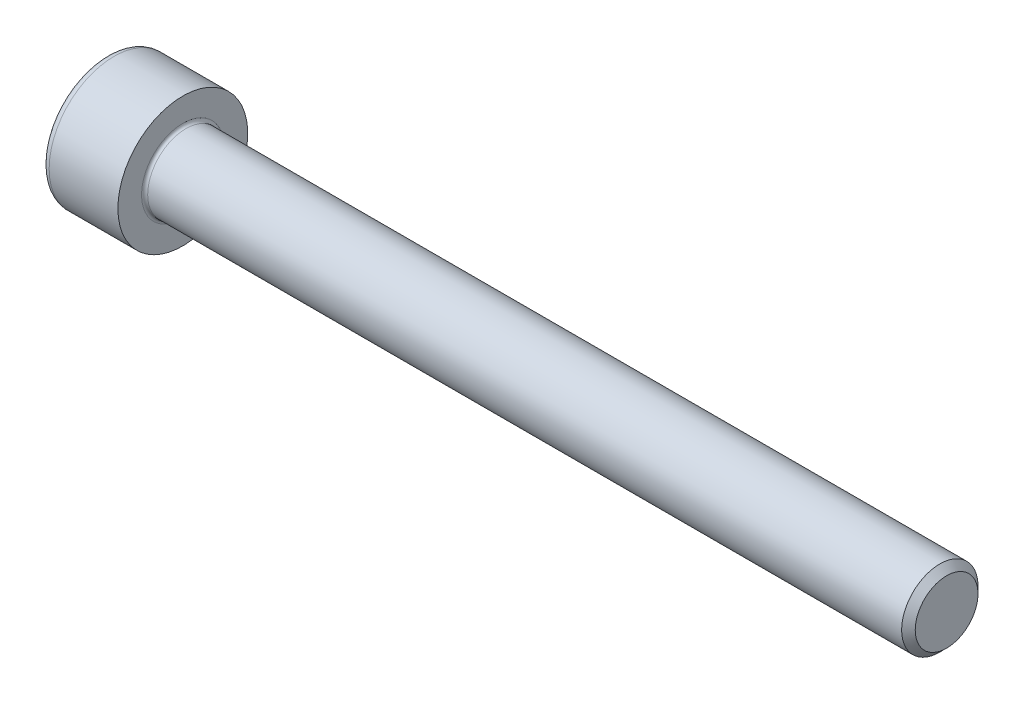
ISO-10303-21;
HEADER;
FILE_DESCRIPTION(('STEP AP214'),'2;1');
FILE_NAME('part.step','',(''),(''),'','','');
FILE_SCHEMA(('AUTOMOTIVE_DESIGN { 1 0 10303 214 1 1 1 1 }'));
ENDSEC;
DATA;
#1=APPLICATION_CONTEXT('core data for automotive mechanical design processes');
#2=APPLICATION_PROTOCOL_DEFINITION('international standard','automotive_design',2000,#1);
#3=PRODUCT_CONTEXT('',#1,'mechanical');
#4=PRODUCT('Part','Part','',(#3));
#5=PRODUCT_RELATED_PRODUCT_CATEGORY('part','',(#4));
#6=PRODUCT_DEFINITION_FORMATION('','',#4);
#7=PRODUCT_DEFINITION_CONTEXT('part definition',#1,'design');
#8=PRODUCT_DEFINITION('design','',#6,#7);
#9=PRODUCT_DEFINITION_SHAPE('','',#8);
#10=(LENGTH_UNIT() NAMED_UNIT(*) SI_UNIT(.MILLI.,.METRE.));
#11=(NAMED_UNIT(*) PLANE_ANGLE_UNIT() SI_UNIT($,.RADIAN.));
#12=(NAMED_UNIT(*) SI_UNIT($,.STERADIAN.) SOLID_ANGLE_UNIT());
#13=UNCERTAINTY_MEASURE_WITH_UNIT(LENGTH_MEASURE(1.E-05),#10,'distance_accuracy_value','');
#14=(GEOMETRIC_REPRESENTATION_CONTEXT(3) GLOBAL_UNCERTAINTY_ASSIGNED_CONTEXT((#13)) GLOBAL_UNIT_ASSIGNED_CONTEXT((#10,
#11,#12)) REPRESENTATION_CONTEXT('',''));
#15=CARTESIAN_POINT('',(0.,0.,0.));
#16=DIRECTION('',(0.,0.,1.));
#17=DIRECTION('',(1.,0.,0.));
#18=AXIS2_PLACEMENT_3D('',#15,#16,#17);
#19=CARTESIAN_POINT('',(0.,0.,0.));
#20=DIRECTION('',(-1.,0.,0.));
#21=DIRECTION('',(0.,0.,1.));
#22=AXIS2_PLACEMENT_3D('',#19,#20,#21);
#23=PLANE('',#22);
#24=DIRECTION('',(0.,-0.499999999999999,0.866025403784439));
#25=VECTOR('',#24,1.);
#26=CARTESIAN_POINT('',(0.,2.32094808214229,0.));
#27=LINE('',#26,#25);
#28=CARTESIAN_POINT('',(0.,2.32094808214229,0.));
#29=VERTEX_POINT('',#28);
#30=CARTESIAN_POINT('',(0.,1.16047404107115,2.01));
#31=VERTEX_POINT('',#30);
#32=EDGE_CURVE('E373',#29,#31,#27,.T.);
#33=ORIENTED_EDGE('',*,*,#32,.T.);
#34=DIRECTION('',(0.,1.,0.));
#35=VECTOR('',#34,1.);
#36=CARTESIAN_POINT('',(0.,-1.16047404107115,2.01));
#37=LINE('',#36,#35);
#38=CARTESIAN_POINT('',(0.,-1.16047404107115,2.01));
#39=VERTEX_POINT('',#38);
#40=EDGE_CURVE('E130',#39,#31,#37,.T.);
#41=ORIENTED_EDGE('',*,*,#40,.F.);
#42=DIRECTION('',(0.,-0.500000000000001,-0.866025403784438));
#43=VECTOR('',#42,1.);
#44=CARTESIAN_POINT('',(0.,-1.16047404107115,2.01));
#45=LINE('',#44,#43);
#46=CARTESIAN_POINT('',(0.,-2.3209480821423,0.));
#47=VERTEX_POINT('',#46);
#48=EDGE_CURVE('E376',#39,#47,#45,.T.);
#49=ORIENTED_EDGE('',*,*,#48,.T.);
#50=DIRECTION('',(0.,0.499999999999999,-0.866025403784439));
#51=VECTOR('',#50,1.);
#52=CARTESIAN_POINT('',(0.,-2.3209480821423,0.));
#53=LINE('',#52,#51);
#54=CARTESIAN_POINT('',(0.,-1.16047404107116,-2.01));
#55=VERTEX_POINT('',#54);
#56=EDGE_CURVE('E379',#47,#55,#53,.T.);
#57=ORIENTED_EDGE('',*,*,#56,.T.);
#58=DIRECTION('',(0.,-1.,0.));
#59=VECTOR('',#58,1.);
#60=CARTESIAN_POINT('',(0.,1.16047404107114,-2.01));
#61=LINE('',#60,#59);
#62=CARTESIAN_POINT('',(0.,1.16047404107114,-2.01));
#63=VERTEX_POINT('',#62);
#64=EDGE_CURVE('E382',#63,#55,#61,.T.);
#65=ORIENTED_EDGE('',*,*,#64,.F.);
#66=DIRECTION('',(0.,-0.500000000000001,-0.866025403784438));
#67=VECTOR('',#66,1.);
#68=CARTESIAN_POINT('',(0.,2.32094808214229,0.));
#69=LINE('',#68,#67);
#70=EDGE_CURVE('E125',#29,#63,#69,.T.);
#71=ORIENTED_EDGE('',*,*,#70,.F.);
#72=EDGE_LOOP('',(#33,#41,#49,#57,#65,#71));
#73=FACE_BOUND('',#72,.T.);
#74=CARTESIAN_POINT('',(0.,0.,0.));
#75=DIRECTION('',(-1.,0.,0.));
#76=DIRECTION('',(0.,0.,1.));
#77=AXIS2_PLACEMENT_3D('',#74,#75,#76);
#78=CIRCLE('',#77,3.75);
#79=CARTESIAN_POINT('',(0.,0.,3.75));
#80=VERTEX_POINT('',#79);
#81=EDGE_CURVE('E42',#80,#80,#78,.T.);
#82=ORIENTED_EDGE('',*,*,#81,.T.);
#83=EDGE_LOOP('',(#82));
#84=FACE_BOUND('',#83,.T.);
#85=ADVANCED_FACE('F34',(#73,#84),#23,.T.);
#86=CARTESIAN_POINT('',(55.,2.055,0.));
#87=DIRECTION('',(1.,0.,0.));
#88=DIRECTION('',(0.,0.,-1.));
#89=AXIS2_PLACEMENT_3D('',#86,#87,#88);
#90=PLANE('',#89);
#91=CARTESIAN_POINT('',(55.,0.,0.));
#92=DIRECTION('',(-1.,0.,0.));
#93=DIRECTION('',(0.,0.,1.));
#94=AXIS2_PLACEMENT_3D('',#91,#92,#93);
#95=CIRCLE('',#94,2.055);
#96=CARTESIAN_POINT('',(55.,0.,2.055));
#97=VERTEX_POINT('',#96);
#98=EDGE_CURVE('E148',#97,#97,#95,.T.);
#99=ORIENTED_EDGE('',*,*,#98,.F.);
#100=EDGE_LOOP('',(#99));
#101=FACE_BOUND('',#100,.T.);
#102=ADVANCED_FACE('F172',(#101),#90,.T.);
#103=CARTESIAN_POINT('',(55.,0.,0.));
#104=DIRECTION('',(-1.,0.,0.));
#105=DIRECTION('',(0.,0.,1.));
#106=AXIS2_PLACEMENT_3D('',#103,#104,#105);
#107=CONICAL_SURFACE('',#106,2.055,0.785398163397421);
#108=CARTESIAN_POINT('',(54.555,0.,0.));
#109=DIRECTION('',(-1.,0.,0.));
#110=DIRECTION('',(0.,0.,1.));
#111=AXIS2_PLACEMENT_3D('',#108,#109,#110);
#112=CIRCLE('',#111,2.49999999999999);
#113=CARTESIAN_POINT('',(54.555,0.,2.49999999999999));
#114=VERTEX_POINT('',#113);
#115=EDGE_CURVE('E145',#114,#114,#112,.T.);
#116=ORIENTED_EDGE('',*,*,#115,.F.);
#117=EDGE_LOOP('',(#116));
#118=FACE_BOUND('',#117,.T.);
#119=ORIENTED_EDGE('',*,*,#98,.T.);
#120=EDGE_LOOP('',(#119));
#121=FACE_BOUND('',#120,.T.);
#122=ADVANCED_FACE('F178',(#118,#121),#107,.T.);
#123=CARTESIAN_POINT('',(-31.75,0.,0.));
#124=DIRECTION('',(-1.,0.,0.));
#125=DIRECTION('',(0.,0.,1.));
#126=AXIS2_PLACEMENT_3D('',#123,#124,#125);
#127=CYLINDRICAL_SURFACE('',#126,2.49999999999999);
#128=CARTESIAN_POINT('',(5.2,0.,0.));
#129=DIRECTION('',(1.,0.,0.));
#130=DIRECTION('',(0.,0.,-1.));
#131=AXIS2_PLACEMENT_3D('',#128,#129,#130);
#132=CIRCLE('',#131,2.49999999999999);
#133=CARTESIAN_POINT('',(5.2,0.,-2.49999999999999));
#134=VERTEX_POINT('',#133);
#135=EDGE_CURVE('E154',#134,#134,#132,.T.);
#136=ORIENTED_EDGE('',*,*,#135,.T.);
#137=EDGE_LOOP('',(#136));
#138=FACE_BOUND('',#137,.T.);
#139=ORIENTED_EDGE('',*,*,#115,.T.);
#140=EDGE_LOOP('',(#139));
#141=FACE_BOUND('',#140,.T.);
#142=ADVANCED_FACE('F190',(#138,#141),#127,.T.);
#143=CARTESIAN_POINT('',(5.,4.25,0.));
#144=DIRECTION('',(1.,0.,0.));
#145=DIRECTION('',(0.,0.,-1.));
#146=AXIS2_PLACEMENT_3D('',#143,#144,#145);
#147=PLANE('',#146);
#148=CARTESIAN_POINT('',(5.,0.,0.));
#149=DIRECTION('',(1.,0.,0.));
#150=DIRECTION('',(0.,0.,-1.));
#151=AXIS2_PLACEMENT_3D('',#148,#149,#150);
#152=CIRCLE('',#151,2.69999999999999);
#153=CARTESIAN_POINT('',(5.,0.,-2.69999999999999));
#154=VERTEX_POINT('',#153);
#155=EDGE_CURVE('E151',#154,#154,#152,.F.);
#156=ORIENTED_EDGE('',*,*,#155,.T.);
#157=EDGE_LOOP('',(#156));
#158=FACE_BOUND('',#157,.T.);
#159=CARTESIAN_POINT('',(5.,0.,0.));
#160=DIRECTION('',(-1.,0.,0.));
#161=DIRECTION('',(0.,0.,1.));
#162=AXIS2_PLACEMENT_3D('',#159,#160,#161);
#163=CIRCLE('',#162,4.25);
#164=CARTESIAN_POINT('',(5.,0.,4.25));
#165=VERTEX_POINT('',#164);
#166=EDGE_CURVE('E141',#165,#165,#163,.T.);
#167=ORIENTED_EDGE('',*,*,#166,.F.);
#168=EDGE_LOOP('',(#167));
#169=FACE_BOUND('',#168,.T.);
#170=ADVANCED_FACE('F186',(#158,#169),#147,.T.);
#171=CARTESIAN_POINT('',(-31.75,0.,0.));
#172=DIRECTION('',(-1.,0.,0.));
#173=DIRECTION('',(0.,0.,1.));
#174=AXIS2_PLACEMENT_3D('',#171,#172,#173);
#175=CYLINDRICAL_SURFACE('',#174,4.25);
#176=CARTESIAN_POINT('',(0.5,0.,0.));
#177=DIRECTION('',(-1.,0.,0.));
#178=DIRECTION('',(0.,0.,1.));
#179=AXIS2_PLACEMENT_3D('',#176,#177,#178);
#180=CIRCLE('',#179,4.25);
#181=CARTESIAN_POINT('',(0.5,0.,4.25));
#182=VERTEX_POINT('',#181);
#183=EDGE_CURVE('E11',#182,#182,#180,.F.);
#184=ORIENTED_EDGE('',*,*,#183,.T.);
#185=EDGE_LOOP('',(#184));
#186=FACE_BOUND('',#185,.T.);
#187=ORIENTED_EDGE('',*,*,#166,.T.);
#188=EDGE_LOOP('',(#187));
#189=FACE_BOUND('',#188,.T.);
#190=ADVANCED_FACE('F168',(#186,#189),#175,.T.);
#191=CARTESIAN_POINT('',(5.2,0.,0.));
#192=DIRECTION('',(1.,0.,0.));
#193=DIRECTION('',(0.,0.,-1.));
#194=AXIS2_PLACEMENT_3D('',#191,#192,#193);
#195=TOROIDAL_SURFACE('',#194,2.69999999999999,0.2);
#196=ORIENTED_EDGE('',*,*,#135,.F.);
#197=EDGE_LOOP('',(#196));
#198=FACE_BOUND('',#197,.T.);
#199=ORIENTED_EDGE('',*,*,#155,.F.);
#200=EDGE_LOOP('',(#199));
#201=FACE_BOUND('',#200,.T.);
#202=ADVANCED_FACE('F161',(#198,#201),#195,.F.);
#203=CARTESIAN_POINT('',(0.5,0.,0.));
#204=DIRECTION('',(-1.,0.,0.));
#205=DIRECTION('',(0.,0.,1.));
#206=AXIS2_PLACEMENT_3D('',#203,#204,#205);
#207=TOROIDAL_SURFACE('',#206,3.75,0.5);
#208=ORIENTED_EDGE('',*,*,#183,.F.);
#209=EDGE_LOOP('',(#208));
#210=FACE_BOUND('',#209,.T.);
#211=ORIENTED_EDGE('',*,*,#81,.F.);
#212=EDGE_LOOP('',(#211));
#213=FACE_BOUND('',#212,.T.);
#214=ADVANCED_FACE('F36',(#210,#213),#207,.T.);
#215=CARTESIAN_POINT('',(2.5,2.32094808214229,0.));
#216=DIRECTION('',(0.,-0.866025403784439,-0.499999999999999));
#217=DIRECTION('',(0.,0.499999999999999,-0.866025403784439));
#218=AXIS2_PLACEMENT_3D('',#215,#216,#217);
#219=PLANE('',#218);
#220=ORIENTED_EDGE('',*,*,#32,.F.);
#221=DIRECTION('',(-1.,0.,0.));
#222=VECTOR('',#221,1.);
#223=CARTESIAN_POINT('',(2.5,2.32094808214229,0.));
#224=LINE('',#223,#222);
#225=CARTESIAN_POINT('',(2.5,2.32094808214229,0.));
#226=VERTEX_POINT('',#225);
#227=EDGE_CURVE('E363',#226,#29,#224,.T.);
#228=ORIENTED_EDGE('',*,*,#227,.F.);
#229=DIRECTION('',(0.,-0.499999999999999,0.866025403784439));
#230=VECTOR('',#229,1.);
#231=CARTESIAN_POINT('',(2.5,2.32094808214229,0.));
#232=LINE('',#231,#230);
#233=CARTESIAN_POINT('',(2.5,1.74071106160672,1.00499999999999));
#234=VERTEX_POINT('',#233);
#235=EDGE_CURVE('E117',#226,#234,#232,.T.);
#236=ORIENTED_EDGE('',*,*,#235,.T.);
#237=CARTESIAN_POINT('',(2.5,1.16047404107115,2.01));
#238=VERTEX_POINT('',#237);
#239=EDGE_CURVE('E108',#234,#238,#232,.T.);
#240=ORIENTED_EDGE('',*,*,#239,.T.);
#241=DIRECTION('',(-1.,0.,0.));
#242=VECTOR('',#241,1.);
#243=CARTESIAN_POINT('',(2.5,1.16047404107115,2.01));
#244=LINE('',#243,#242);
#245=EDGE_CURVE('E122',#238,#31,#244,.T.);
#246=ORIENTED_EDGE('',*,*,#245,.T.);
#247=EDGE_LOOP('',(#220,#228,#236,#240,#246));
#248=FACE_BOUND('',#247,.T.);
#249=ADVANCED_FACE('F121',(#248),#219,.T.);
#250=CARTESIAN_POINT('',(2.5,-1.16047404107115,2.01));
#251=DIRECTION('',(0.,0.,1.));
#252=DIRECTION('',(0.,-1.,0.));
#253=AXIS2_PLACEMENT_3D('',#250,#251,#252);
#254=PLANE('',#253);
#255=ORIENTED_EDGE('',*,*,#40,.T.);
#256=ORIENTED_EDGE('',*,*,#245,.F.);
#257=DIRECTION('',(0.,1.,0.));
#258=VECTOR('',#257,1.);
#259=CARTESIAN_POINT('',(2.5,-1.16047404107115,2.01));
#260=LINE('',#259,#258);
#261=CARTESIAN_POINT('',(2.5,0.,2.01));
#262=VERTEX_POINT('',#261);
#263=EDGE_CURVE('E105',#262,#238,#260,.T.);
#264=ORIENTED_EDGE('',*,*,#263,.F.);
#265=CARTESIAN_POINT('',(2.5,-1.16047404107115,2.01));
#266=VERTEX_POINT('',#265);
#267=EDGE_CURVE('E116',#266,#262,#260,.T.);
#268=ORIENTED_EDGE('',*,*,#267,.F.);
#269=DIRECTION('',(-1.,0.,0.));
#270=VECTOR('',#269,1.);
#271=CARTESIAN_POINT('',(2.5,-1.16047404107115,2.01));
#272=LINE('',#271,#270);
#273=EDGE_CURVE('E132',#266,#39,#272,.T.);
#274=ORIENTED_EDGE('',*,*,#273,.T.);
#275=EDGE_LOOP('',(#255,#256,#264,#268,#274));
#276=FACE_BOUND('',#275,.T.);
#277=ADVANCED_FACE('F127',(#276),#254,.F.);
#278=CARTESIAN_POINT('',(2.5,-1.16047404107115,2.01));
#279=DIRECTION('',(0.,0.866025403784438,-0.500000000000001));
#280=DIRECTION('',(0.,0.500000000000001,0.866025403784438));
#281=AXIS2_PLACEMENT_3D('',#278,#279,#280);
#282=PLANE('',#281);
#283=ORIENTED_EDGE('',*,*,#48,.F.);
#284=ORIENTED_EDGE('',*,*,#273,.F.);
#285=DIRECTION('',(0.,-0.500000000000001,-0.866025403784438));
#286=VECTOR('',#285,1.);
#287=CARTESIAN_POINT('',(2.5,-1.16047404107115,2.01));
#288=LINE('',#287,#286);
#289=CARTESIAN_POINT('',(2.5,-1.74071106160672,1.005));
#290=VERTEX_POINT('',#289);
#291=EDGE_CURVE('E402',#266,#290,#288,.T.);
#292=ORIENTED_EDGE('',*,*,#291,.T.);
#293=CARTESIAN_POINT('',(2.5,-2.3209480821423,0.));
#294=VERTEX_POINT('',#293);
#295=EDGE_CURVE('E391',#290,#294,#288,.T.);
#296=ORIENTED_EDGE('',*,*,#295,.T.);
#297=DIRECTION('',(-1.,0.,0.));
#298=VECTOR('',#297,1.);
#299=CARTESIAN_POINT('',(2.5,-2.3209480821423,0.));
#300=LINE('',#299,#298);
#301=EDGE_CURVE('E137',#294,#47,#300,.T.);
#302=ORIENTED_EDGE('',*,*,#301,.T.);
#303=EDGE_LOOP('',(#283,#284,#292,#296,#302));
#304=FACE_BOUND('',#303,.T.);
#305=ADVANCED_FACE('F254',(#304),#282,.T.);
#306=CARTESIAN_POINT('',(2.5,-2.3209480821423,0.));
#307=DIRECTION('',(0.,0.866025403784439,0.499999999999999));
#308=DIRECTION('',(0.,-0.499999999999999,0.866025403784439));
#309=AXIS2_PLACEMENT_3D('',#306,#307,#308);
#310=PLANE('',#309);
#311=ORIENTED_EDGE('',*,*,#56,.F.);
#312=ORIENTED_EDGE('',*,*,#301,.F.);
#313=DIRECTION('',(0.,0.499999999999999,-0.866025403784439));
#314=VECTOR('',#313,1.);
#315=CARTESIAN_POINT('',(2.5,-2.3209480821423,0.));
#316=LINE('',#315,#314);
#317=CARTESIAN_POINT('',(2.5,-1.74071106160673,-1.005));
#318=VERTEX_POINT('',#317);
#319=EDGE_CURVE('E369',#294,#318,#316,.T.);
#320=ORIENTED_EDGE('',*,*,#319,.T.);
#321=CARTESIAN_POINT('',(2.5,-1.16047404107116,-2.01));
#322=VERTEX_POINT('',#321);
#323=EDGE_CURVE('E401',#318,#322,#316,.T.);
#324=ORIENTED_EDGE('',*,*,#323,.T.);
#325=DIRECTION('',(-1.,0.,0.));
#326=VECTOR('',#325,1.);
#327=CARTESIAN_POINT('',(2.5,-1.16047404107116,-2.01));
#328=LINE('',#327,#326);
#329=EDGE_CURVE('E362',#322,#55,#328,.T.);
#330=ORIENTED_EDGE('',*,*,#329,.T.);
#331=EDGE_LOOP('',(#311,#312,#320,#324,#330));
#332=FACE_BOUND('',#331,.T.);
#333=ADVANCED_FACE('F262',(#332),#310,.T.);
#334=CARTESIAN_POINT('',(2.5,1.16047404107114,-2.01));
#335=DIRECTION('',(0.,0.,-1.));
#336=DIRECTION('',(0.,1.,0.));
#337=AXIS2_PLACEMENT_3D('',#334,#335,#336);
#338=PLANE('',#337);
#339=ORIENTED_EDGE('',*,*,#64,.T.);
#340=ORIENTED_EDGE('',*,*,#329,.F.);
#341=DIRECTION('',(0.,-1.,0.));
#342=VECTOR('',#341,1.);
#343=CARTESIAN_POINT('',(2.5,1.16047404107114,-2.01));
#344=LINE('',#343,#342);
#345=CARTESIAN_POINT('',(2.5,0.,-2.01));
#346=VERTEX_POINT('',#345);
#347=EDGE_CURVE('E366',#346,#322,#344,.T.);
#348=ORIENTED_EDGE('',*,*,#347,.F.);
#349=CARTESIAN_POINT('',(2.5,1.16047404107114,-2.01));
#350=VERTEX_POINT('',#349);
#351=EDGE_CURVE('E49',#350,#346,#344,.T.);
#352=ORIENTED_EDGE('',*,*,#351,.F.);
#353=DIRECTION('',(-1.,0.,0.));
#354=VECTOR('',#353,1.);
#355=CARTESIAN_POINT('',(2.5,1.16047404107114,-2.01));
#356=LINE('',#355,#354);
#357=EDGE_CURVE('E359',#350,#63,#356,.T.);
#358=ORIENTED_EDGE('',*,*,#357,.T.);
#359=EDGE_LOOP('',(#339,#340,#348,#352,#358));
#360=FACE_BOUND('',#359,.T.);
#361=ADVANCED_FACE('F271',(#360),#338,.F.);
#362=CARTESIAN_POINT('',(2.5,2.32094808214229,0.));
#363=DIRECTION('',(0.,0.866025403784438,-0.500000000000001));
#364=DIRECTION('',(0.,0.500000000000001,0.866025403784438));
#365=AXIS2_PLACEMENT_3D('',#362,#363,#364);
#366=PLANE('',#365);
#367=ORIENTED_EDGE('',*,*,#70,.T.);
#368=ORIENTED_EDGE('',*,*,#357,.F.);
#369=DIRECTION('',(0.,-0.500000000000001,-0.866025403784438));
#370=VECTOR('',#369,1.);
#371=CARTESIAN_POINT('',(2.5,2.32094808214229,0.));
#372=LINE('',#371,#370);
#373=CARTESIAN_POINT('',(2.5,1.74071106160672,-1.005));
#374=VERTEX_POINT('',#373);
#375=EDGE_CURVE('E349',#374,#350,#372,.T.);
#376=ORIENTED_EDGE('',*,*,#375,.F.);
#377=EDGE_CURVE('E355',#226,#374,#372,.T.);
#378=ORIENTED_EDGE('',*,*,#377,.F.);
#379=ORIENTED_EDGE('',*,*,#227,.T.);
#380=EDGE_LOOP('',(#367,#368,#376,#378,#379));
#381=FACE_BOUND('',#380,.T.);
#382=ADVANCED_FACE('F280',(#381),#366,.F.);
#383=CARTESIAN_POINT('',(2.5,3.48142212321343,-2.01000000000001));
#384=DIRECTION('',(1.,0.,0.));
#385=DIRECTION('',(0.,0.,-1.));
#386=AXIS2_PLACEMENT_3D('',#383,#384,#385);
#387=PLANE('',#386);
#388=ORIENTED_EDGE('',*,*,#347,.T.);
#389=ORIENTED_EDGE('',*,*,#323,.F.);
#390=CARTESIAN_POINT('',(2.5,0.,0.));
#391=DIRECTION('',(-1.,0.,0.));
#392=DIRECTION('',(0.,0.,1.));
#393=AXIS2_PLACEMENT_3D('',#390,#391,#392);
#394=CIRCLE('',#393,2.01);
#395=EDGE_CURVE('E397',#346,#318,#394,.T.);
#396=ORIENTED_EDGE('',*,*,#395,.F.);
#397=EDGE_LOOP('',(#388,#389,#396));
#398=FACE_BOUND('',#397,.T.);
#399=ADVANCED_FACE('F289',(#398),#387,.F.);
#400=ORIENTED_EDGE('',*,*,#319,.F.);
#401=ORIENTED_EDGE('',*,*,#295,.F.);
#402=EDGE_CURVE('E135',#318,#290,#394,.T.);
#403=ORIENTED_EDGE('',*,*,#402,.F.);
#404=EDGE_LOOP('',(#400,#401,#403));
#405=FACE_BOUND('',#404,.T.);
#406=ADVANCED_FACE('F298',(#405),#387,.F.);
#407=ORIENTED_EDGE('',*,*,#291,.F.);
#408=ORIENTED_EDGE('',*,*,#267,.T.);
#409=EDGE_CURVE('E131',#290,#262,#394,.T.);
#410=ORIENTED_EDGE('',*,*,#409,.F.);
#411=EDGE_LOOP('',(#407,#408,#410));
#412=FACE_BOUND('',#411,.T.);
#413=ADVANCED_FACE('F307',(#412),#387,.F.);
#414=ORIENTED_EDGE('',*,*,#263,.T.);
#415=ORIENTED_EDGE('',*,*,#239,.F.);
#416=EDGE_CURVE('E111',#262,#234,#394,.T.);
#417=ORIENTED_EDGE('',*,*,#416,.F.);
#418=EDGE_LOOP('',(#414,#415,#417));
#419=FACE_BOUND('',#418,.T.);
#420=ADVANCED_FACE('F107',(#419),#387,.F.);
#421=ORIENTED_EDGE('',*,*,#235,.F.);
#422=ORIENTED_EDGE('',*,*,#377,.T.);
#423=EDGE_CURVE('E142',#234,#374,#394,.T.);
#424=ORIENTED_EDGE('',*,*,#423,.F.);
#425=EDGE_LOOP('',(#421,#422,#424));
#426=FACE_BOUND('',#425,.T.);
#427=ADVANCED_FACE('F322',(#426),#387,.F.);
#428=ORIENTED_EDGE('',*,*,#375,.T.);
#429=ORIENTED_EDGE('',*,*,#351,.T.);
#430=EDGE_CURVE('E352',#374,#346,#394,.T.);
#431=ORIENTED_EDGE('',*,*,#430,.F.);
#432=EDGE_LOOP('',(#428,#429,#431));
#433=FACE_BOUND('',#432,.T.);
#434=ADVANCED_FACE('F237',(#433),#387,.F.);
#435=CARTESIAN_POINT('',(2.5,0.,0.));
#436=DIRECTION('',(-1.,0.,0.));
#437=DIRECTION('',(0.,0.,1.));
#438=AXIS2_PLACEMENT_3D('',#435,#436,#437);
#439=CONICAL_SURFACE('',#438,2.01,1.04719755119659);
#440=CARTESIAN_POINT('',(3.66047404107116,0.,0.));
#441=VERTEX_POINT('',#440);
#442=VERTEX_LOOP('',#441);
#443=FACE_BOUND('',#442,.T.);
#444=ORIENTED_EDGE('',*,*,#416,.T.);
#445=ORIENTED_EDGE('',*,*,#423,.T.);
#446=ORIENTED_EDGE('',*,*,#430,.T.);
#447=ORIENTED_EDGE('',*,*,#395,.T.);
#448=ORIENTED_EDGE('',*,*,#402,.T.);
#449=ORIENTED_EDGE('',*,*,#409,.T.);
#450=EDGE_LOOP('',(#444,#445,#446,#447,#448,#449));
#451=FACE_BOUND('',#450,.T.);
#452=ADVANCED_FACE('F183',(#443,#451),#439,.F.);
#453=CLOSED_SHELL('',(#85,#102,#122,#142,#170,#190,#202,#214,#249,#277,#305,#333,#361,#382,#399,
#406,#413,#420,#427,#434,#452));
#454=MANIFOLD_SOLID_BREP('B2',#453);
#455=ADVANCED_BREP_SHAPE_REPRESENTATION('',(#18,#454),#14);
#456=SHAPE_DEFINITION_REPRESENTATION(#9,#455);
ENDSEC;
END-ISO-10303-21;
